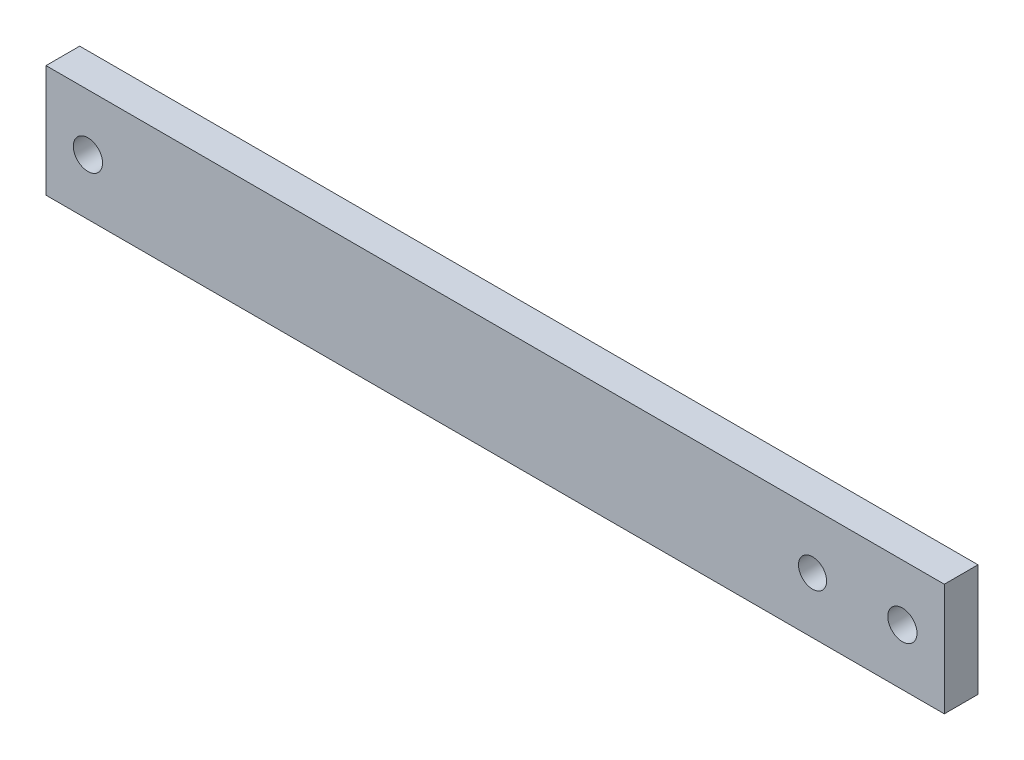
ISO-10303-21;
HEADER;
FILE_DESCRIPTION(('STEP AP214'),'2;1');
FILE_NAME('part.step','',(''),(''),'','','');
FILE_SCHEMA(('AUTOMOTIVE_DESIGN { 1 0 10303 214 1 1 1 1 }'));
ENDSEC;
DATA;
#1=APPLICATION_CONTEXT('core data for automotive mechanical design processes');
#2=APPLICATION_PROTOCOL_DEFINITION('international standard','automotive_design',2000,#1);
#3=PRODUCT_CONTEXT('',#1,'mechanical');
#4=PRODUCT('Part','Part','',(#3));
#5=PRODUCT_RELATED_PRODUCT_CATEGORY('part','',(#4));
#6=PRODUCT_DEFINITION_FORMATION('','',#4);
#7=PRODUCT_DEFINITION_CONTEXT('part definition',#1,'design');
#8=PRODUCT_DEFINITION('design','',#6,#7);
#9=PRODUCT_DEFINITION_SHAPE('','',#8);
#10=(LENGTH_UNIT() NAMED_UNIT(*) SI_UNIT(.MILLI.,.METRE.));
#11=(NAMED_UNIT(*) PLANE_ANGLE_UNIT() SI_UNIT($,.RADIAN.));
#12=(NAMED_UNIT(*) SI_UNIT($,.STERADIAN.) SOLID_ANGLE_UNIT());
#13=UNCERTAINTY_MEASURE_WITH_UNIT(LENGTH_MEASURE(1.E-05),#10,'distance_accuracy_value','');
#14=(GEOMETRIC_REPRESENTATION_CONTEXT(3) GLOBAL_UNCERTAINTY_ASSIGNED_CONTEXT((#13)) GLOBAL_UNIT_ASSIGNED_CONTEXT((#10,
#11,#12)) REPRESENTATION_CONTEXT('',''));
#15=CARTESIAN_POINT('',(0.,0.,0.));
#16=DIRECTION('',(0.,0.,1.));
#17=DIRECTION('',(1.,0.,0.));
#18=AXIS2_PLACEMENT_3D('',#15,#16,#17);
#19=CARTESIAN_POINT('',(0.,0.,3.));
#20=DIRECTION('',(0.,0.,-1.));
#21=DIRECTION('',(-1.,0.,0.));
#22=AXIS2_PLACEMENT_3D('',#19,#20,#21);
#23=PLANE('',#22);
#24=CARTESIAN_POINT('',(99.5328347861484,5.,3.));
#25=DIRECTION('',(0.,0.,1.));
#26=DIRECTION('',(1.,0.,0.));
#27=AXIS2_PLACEMENT_3D('',#24,#25,#26);
#28=CIRCLE('',#27,1.24999999999999);
#29=CARTESIAN_POINT('',(100.782834786148,5.,3.));
#30=VERTEX_POINT('',#29);
#31=EDGE_CURVE('E128',#30,#30,#28,.T.);
#32=ORIENTED_EDGE('',*,*,#31,.F.);
#33=EDGE_LOOP('',(#32));
#34=FACE_BOUND('',#33,.T.);
#35=CARTESIAN_POINT('',(35.,5.,3.));
#36=DIRECTION('',(0.,0.,1.));
#37=DIRECTION('',(1.,0.,0.));
#38=AXIS2_PLACEMENT_3D('',#35,#36,#37);
#39=CIRCLE('',#38,1.30096321323293);
#40=CARTESIAN_POINT('',(36.3009632132329,5.,3.));
#41=VERTEX_POINT('',#40);
#42=EDGE_CURVE('E102',#41,#41,#39,.T.);
#43=ORIENTED_EDGE('',*,*,#42,.F.);
#44=EDGE_LOOP('',(#43));
#45=FACE_BOUND('',#44,.T.);
#46=DIRECTION('',(0.,-1.,0.));
#47=VECTOR('',#46,1.);
#48=CARTESIAN_POINT('',(31.2664173930742,0.,3.));
#49=LINE('',#48,#47);
#50=CARTESIAN_POINT('',(31.2664173930742,10.,3.));
#51=VERTEX_POINT('',#50);
#52=CARTESIAN_POINT('',(31.2664173930742,0.,3.));
#53=VERTEX_POINT('',#52);
#54=EDGE_CURVE('E87',#51,#53,#49,.T.);
#55=ORIENTED_EDGE('',*,*,#54,.T.);
#56=DIRECTION('',(1.,0.,0.));
#57=VECTOR('',#56,1.);
#58=CARTESIAN_POINT('',(31.2664173930742,0.,3.));
#59=LINE('',#58,#57);
#60=CARTESIAN_POINT('',(111.266417393074,0.,3.));
#61=VERTEX_POINT('',#60);
#62=EDGE_CURVE('E82',#53,#61,#59,.T.);
#63=ORIENTED_EDGE('',*,*,#62,.T.);
#64=DIRECTION('',(0.,1.,0.));
#65=VECTOR('',#64,1.);
#66=CARTESIAN_POINT('',(111.266417393074,0.,3.));
#67=LINE('',#66,#65);
#68=CARTESIAN_POINT('',(111.266417393074,10.,3.));
#69=VERTEX_POINT('',#68);
#70=EDGE_CURVE('E85',#61,#69,#67,.T.);
#71=ORIENTED_EDGE('',*,*,#70,.T.);
#72=DIRECTION('',(-1.,0.,0.));
#73=VECTOR('',#72,1.);
#74=CARTESIAN_POINT('',(31.2664173930742,10.,3.));
#75=LINE('',#74,#73);
#76=EDGE_CURVE('E52',#69,#51,#75,.T.);
#77=ORIENTED_EDGE('',*,*,#76,.T.);
#78=EDGE_LOOP('',(#55,#63,#71,#77));
#79=FACE_BOUND('',#78,.T.);
#80=CARTESIAN_POINT('',(107.532834786148,5.,3.));
#81=DIRECTION('',(0.,0.,1.));
#82=DIRECTION('',(-1.,0.,0.));
#83=AXIS2_PLACEMENT_3D('',#80,#81,#82);
#84=CIRCLE('',#83,1.30096321323293);
#85=CARTESIAN_POINT('',(106.231871572915,5.,3.));
#86=VERTEX_POINT('',#85);
#87=EDGE_CURVE('E117',#86,#86,#84,.T.);
#88=ORIENTED_EDGE('',*,*,#87,.F.);
#89=EDGE_LOOP('',(#88));
#90=FACE_BOUND('',#89,.T.);
#91=ADVANCED_FACE('F35',(#34,#45,#79,#90),#23,.F.);
#92=CARTESIAN_POINT('',(0.,0.,0.));
#93=DIRECTION('',(0.,0.,-1.));
#94=DIRECTION('',(-1.,0.,0.));
#95=AXIS2_PLACEMENT_3D('',#92,#93,#94);
#96=PLANE('',#95);
#97=CARTESIAN_POINT('',(99.5328347861484,5.,0.));
#98=DIRECTION('',(0.,0.,-1.));
#99=DIRECTION('',(-1.,0.,0.));
#100=AXIS2_PLACEMENT_3D('',#97,#98,#99);
#101=CIRCLE('',#100,1.24999999999999);
#102=CARTESIAN_POINT('',(98.2828347861484,5.,0.));
#103=VERTEX_POINT('',#102);
#104=EDGE_CURVE('E123',#103,#103,#101,.T.);
#105=ORIENTED_EDGE('',*,*,#104,.F.);
#106=EDGE_LOOP('',(#105));
#107=FACE_BOUND('',#106,.T.);
#108=CARTESIAN_POINT('',(35.,5.,0.));
#109=DIRECTION('',(0.,0.,1.));
#110=DIRECTION('',(1.,0.,0.));
#111=AXIS2_PLACEMENT_3D('',#108,#109,#110);
#112=CIRCLE('',#111,1.30096321323293);
#113=CARTESIAN_POINT('',(36.3009632132329,5.,0.));
#114=VERTEX_POINT('',#113);
#115=EDGE_CURVE('E114',#114,#114,#112,.T.);
#116=ORIENTED_EDGE('',*,*,#115,.T.);
#117=EDGE_LOOP('',(#116));
#118=FACE_BOUND('',#117,.T.);
#119=DIRECTION('',(0.,-1.,0.));
#120=VECTOR('',#119,1.);
#121=CARTESIAN_POINT('',(31.2664173930742,0.,0.));
#122=LINE('',#121,#120);
#123=CARTESIAN_POINT('',(31.2664173930742,10.,0.));
#124=VERTEX_POINT('',#123);
#125=CARTESIAN_POINT('',(31.2664173930742,0.,0.));
#126=VERTEX_POINT('',#125);
#127=EDGE_CURVE('E99',#124,#126,#122,.T.);
#128=ORIENTED_EDGE('',*,*,#127,.F.);
#129=DIRECTION('',(-1.,0.,0.));
#130=VECTOR('',#129,1.);
#131=CARTESIAN_POINT('',(31.2664173930742,10.,0.));
#132=LINE('',#131,#130);
#133=CARTESIAN_POINT('',(111.266417393074,10.,0.));
#134=VERTEX_POINT('',#133);
#135=EDGE_CURVE('E75',#134,#124,#132,.T.);
#136=ORIENTED_EDGE('',*,*,#135,.F.);
#137=DIRECTION('',(0.,1.,0.));
#138=VECTOR('',#137,1.);
#139=CARTESIAN_POINT('',(111.266417393074,0.,0.));
#140=LINE('',#139,#138);
#141=CARTESIAN_POINT('',(111.266417393074,0.,0.));
#142=VERTEX_POINT('',#141);
#143=EDGE_CURVE('E69',#142,#134,#140,.T.);
#144=ORIENTED_EDGE('',*,*,#143,.F.);
#145=DIRECTION('',(1.,0.,0.));
#146=VECTOR('',#145,1.);
#147=CARTESIAN_POINT('',(31.2664173930742,0.,0.));
#148=LINE('',#147,#146);
#149=EDGE_CURVE('E91',#126,#142,#148,.T.);
#150=ORIENTED_EDGE('',*,*,#149,.F.);
#151=EDGE_LOOP('',(#128,#136,#144,#150));
#152=FACE_BOUND('',#151,.T.);
#153=CARTESIAN_POINT('',(107.532834786148,5.,0.));
#154=DIRECTION('',(0.,0.,1.));
#155=DIRECTION('',(-1.,0.,0.));
#156=AXIS2_PLACEMENT_3D('',#153,#154,#155);
#157=CIRCLE('',#156,1.30096321323293);
#158=CARTESIAN_POINT('',(106.231871572915,5.,0.));
#159=VERTEX_POINT('',#158);
#160=EDGE_CURVE('E120',#159,#159,#157,.T.);
#161=ORIENTED_EDGE('',*,*,#160,.T.);
#162=EDGE_LOOP('',(#161));
#163=FACE_BOUND('',#162,.T.);
#164=ADVANCED_FACE('F110',(#107,#118,#152,#163),#96,.T.);
#165=CARTESIAN_POINT('',(31.2664173930742,0.,3.));
#166=DIRECTION('',(1.,0.,0.));
#167=DIRECTION('',(0.,0.,-1.));
#168=AXIS2_PLACEMENT_3D('',#165,#166,#167);
#169=PLANE('',#168);
#170=ORIENTED_EDGE('',*,*,#127,.T.);
#171=DIRECTION('',(0.,0.,-1.));
#172=VECTOR('',#171,1.);
#173=CARTESIAN_POINT('',(31.2664173930742,0.,3.));
#174=LINE('',#173,#172);
#175=EDGE_CURVE('E11',#53,#126,#174,.T.);
#176=ORIENTED_EDGE('',*,*,#175,.F.);
#177=ORIENTED_EDGE('',*,*,#54,.F.);
#178=DIRECTION('',(0.,0.,-1.));
#179=VECTOR('',#178,1.);
#180=CARTESIAN_POINT('',(31.2664173930742,10.,3.));
#181=LINE('',#180,#179);
#182=EDGE_CURVE('E95',#51,#124,#181,.T.);
#183=ORIENTED_EDGE('',*,*,#182,.T.);
#184=EDGE_LOOP('',(#170,#176,#177,#183));
#185=FACE_BOUND('',#184,.T.);
#186=ADVANCED_FACE('F37',(#185),#169,.F.);
#187=CARTESIAN_POINT('',(31.2664173930742,0.,3.));
#188=DIRECTION('',(0.,1.,0.));
#189=DIRECTION('',(0.,0.,1.));
#190=AXIS2_PLACEMENT_3D('',#187,#188,#189);
#191=PLANE('',#190);
#192=ORIENTED_EDGE('',*,*,#149,.T.);
#193=DIRECTION('',(0.,0.,-1.));
#194=VECTOR('',#193,1.);
#195=CARTESIAN_POINT('',(111.266417393074,0.,3.));
#196=LINE('',#195,#194);
#197=EDGE_CURVE('E44',#61,#142,#196,.T.);
#198=ORIENTED_EDGE('',*,*,#197,.F.);
#199=ORIENTED_EDGE('',*,*,#62,.F.);
#200=ORIENTED_EDGE('',*,*,#175,.T.);
#201=EDGE_LOOP('',(#192,#198,#199,#200));
#202=FACE_BOUND('',#201,.T.);
#203=ADVANCED_FACE('F90',(#202),#191,.F.);
#204=CARTESIAN_POINT('',(111.266417393074,0.,3.));
#205=DIRECTION('',(-1.,0.,0.));
#206=DIRECTION('',(0.,0.,1.));
#207=AXIS2_PLACEMENT_3D('',#204,#205,#206);
#208=PLANE('',#207);
#209=ORIENTED_EDGE('',*,*,#143,.T.);
#210=DIRECTION('',(0.,0.,-1.));
#211=VECTOR('',#210,1.);
#212=CARTESIAN_POINT('',(111.266417393074,10.,3.));
#213=LINE('',#212,#211);
#214=EDGE_CURVE('E92',#69,#134,#213,.T.);
#215=ORIENTED_EDGE('',*,*,#214,.F.);
#216=ORIENTED_EDGE('',*,*,#70,.F.);
#217=ORIENTED_EDGE('',*,*,#197,.T.);
#218=EDGE_LOOP('',(#209,#215,#216,#217));
#219=FACE_BOUND('',#218,.T.);
#220=ADVANCED_FACE('F93',(#219),#208,.F.);
#221=CARTESIAN_POINT('',(31.2664173930742,10.,3.));
#222=DIRECTION('',(0.,-1.,0.));
#223=DIRECTION('',(0.,0.,-1.));
#224=AXIS2_PLACEMENT_3D('',#221,#222,#223);
#225=PLANE('',#224);
#226=ORIENTED_EDGE('',*,*,#135,.T.);
#227=ORIENTED_EDGE('',*,*,#182,.F.);
#228=ORIENTED_EDGE('',*,*,#76,.F.);
#229=ORIENTED_EDGE('',*,*,#214,.T.);
#230=EDGE_LOOP('',(#226,#227,#228,#229));
#231=FACE_BOUND('',#230,.T.);
#232=ADVANCED_FACE('F107',(#231),#225,.F.);
#233=CARTESIAN_POINT('',(35.,5.,3.));
#234=DIRECTION('',(0.,0.,-1.));
#235=DIRECTION('',(-1.,0.,0.));
#236=AXIS2_PLACEMENT_3D('',#233,#234,#235);
#237=CYLINDRICAL_SURFACE('',#236,1.30096321323293);
#238=ORIENTED_EDGE('',*,*,#42,.T.);
#239=EDGE_LOOP('',(#238));
#240=FACE_BOUND('',#239,.T.);
#241=ORIENTED_EDGE('',*,*,#115,.F.);
#242=EDGE_LOOP('',(#241));
#243=FACE_BOUND('',#242,.T.);
#244=ADVANCED_FACE('F139',(#240,#243),#237,.F.);
#245=CARTESIAN_POINT('',(107.532834786148,5.,3.));
#246=DIRECTION('',(0.,0.,-1.));
#247=DIRECTION('',(-1.,0.,0.));
#248=AXIS2_PLACEMENT_3D('',#245,#246,#247);
#249=CYLINDRICAL_SURFACE('',#248,1.30096321323293);
#250=ORIENTED_EDGE('',*,*,#87,.T.);
#251=EDGE_LOOP('',(#250));
#252=FACE_BOUND('',#251,.T.);
#253=ORIENTED_EDGE('',*,*,#160,.F.);
#254=EDGE_LOOP('',(#253));
#255=FACE_BOUND('',#254,.T.);
#256=ADVANCED_FACE('F142',(#252,#255),#249,.F.);
#257=CARTESIAN_POINT('',(99.5328347861484,5.,3.));
#258=DIRECTION('',(0.,0.,1.));
#259=DIRECTION('',(1.,0.,0.));
#260=AXIS2_PLACEMENT_3D('',#257,#258,#259);
#261=CYLINDRICAL_SURFACE('',#260,1.24999999999999);
#262=ORIENTED_EDGE('',*,*,#104,.T.);
#263=EDGE_LOOP('',(#262));
#264=FACE_BOUND('',#263,.T.);
#265=ORIENTED_EDGE('',*,*,#31,.T.);
#266=EDGE_LOOP('',(#265));
#267=FACE_BOUND('',#266,.T.);
#268=ADVANCED_FACE('F132',(#264,#267),#261,.F.);
#269=CLOSED_SHELL('',(#91,#164,#186,#203,#220,#232,#244,#256,#268));
#270=MANIFOLD_SOLID_BREP('B2',#269);
#271=ADVANCED_BREP_SHAPE_REPRESENTATION('',(#18,#270),#14);
#272=SHAPE_DEFINITION_REPRESENTATION(#9,#271);
ENDSEC;
END-ISO-10303-21;
